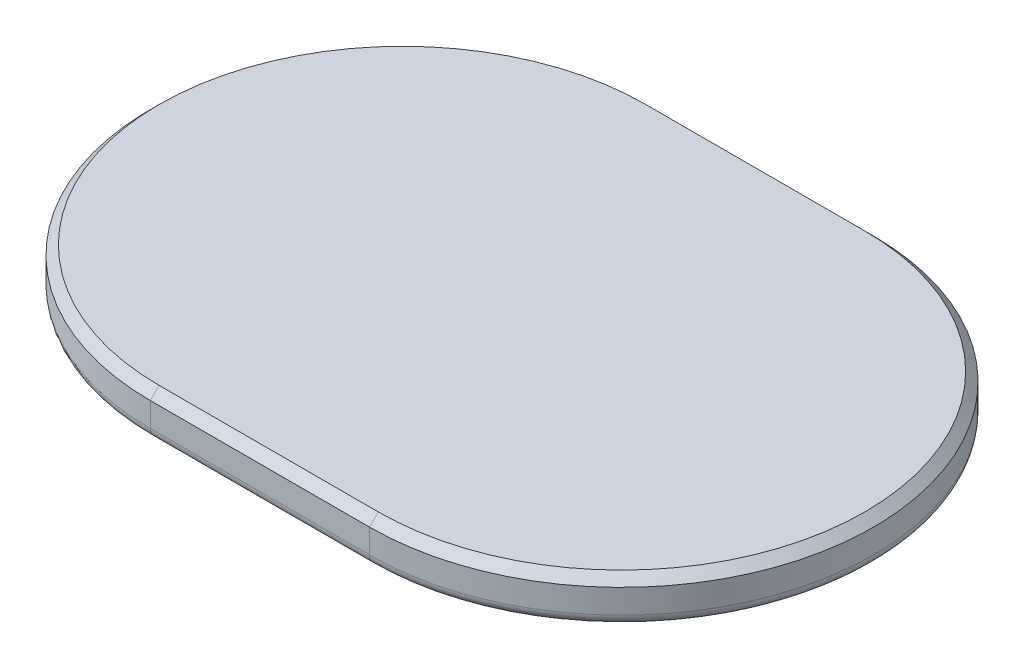
ISO-10303-21;
HEADER;
FILE_DESCRIPTION(('STEP AP214'),'2;1');
FILE_NAME('part.step','',(''),(''),'','','');
FILE_SCHEMA(('AUTOMOTIVE_DESIGN { 1 0 10303 214 1 1 1 1 }'));
ENDSEC;
DATA;
#1=APPLICATION_CONTEXT('core data for automotive mechanical design processes');
#2=APPLICATION_PROTOCOL_DEFINITION('international standard','automotive_design',2000,#1);
#3=PRODUCT_CONTEXT('',#1,'mechanical');
#4=PRODUCT('Part','Part','',(#3));
#5=PRODUCT_RELATED_PRODUCT_CATEGORY('part','',(#4));
#6=PRODUCT_DEFINITION_FORMATION('','',#4);
#7=PRODUCT_DEFINITION_CONTEXT('part definition',#1,'design');
#8=PRODUCT_DEFINITION('design','',#6,#7);
#9=PRODUCT_DEFINITION_SHAPE('','',#8);
#10=(LENGTH_UNIT() NAMED_UNIT(*) SI_UNIT(.MILLI.,.METRE.));
#11=(NAMED_UNIT(*) PLANE_ANGLE_UNIT() SI_UNIT($,.RADIAN.));
#12=(NAMED_UNIT(*) SI_UNIT($,.STERADIAN.) SOLID_ANGLE_UNIT());
#13=UNCERTAINTY_MEASURE_WITH_UNIT(LENGTH_MEASURE(1.E-05),#10,'distance_accuracy_value','');
#14=(GEOMETRIC_REPRESENTATION_CONTEXT(3) GLOBAL_UNCERTAINTY_ASSIGNED_CONTEXT((#13)) GLOBAL_UNIT_ASSIGNED_CONTEXT((#10,
#11,#12)) REPRESENTATION_CONTEXT('',''));
#15=CARTESIAN_POINT('',(0.,0.,0.));
#16=DIRECTION('',(0.,0.,1.));
#17=DIRECTION('',(1.,0.,0.));
#18=AXIS2_PLACEMENT_3D('',#15,#16,#17);
#19=CARTESIAN_POINT('',(-10.,4.,0.));
#20=DIRECTION('',(0.,-1.,0.));
#21=DIRECTION('',(0.,0.,-1.));
#22=AXIS2_PLACEMENT_3D('',#19,#20,#21);
#23=CYLINDRICAL_SURFACE('',#22,23.);
#24=DIRECTION('',(0.,-1.,0.));
#25=VECTOR('',#24,1.);
#26=CARTESIAN_POINT('',(-10.,4.,-23.));
#27=LINE('',#26,#25);
#28=CARTESIAN_POINT('',(-10.,3.19999999999999,-23.));
#29=VERTEX_POINT('',#28);
#30=CARTESIAN_POINT('',(-10.,1.,-23.));
#31=VERTEX_POINT('',#30);
#32=EDGE_CURVE('E155',#29,#31,#27,.T.);
#33=ORIENTED_EDGE('',*,*,#32,.T.);
#34=CARTESIAN_POINT('',(-10.,1.,0.));
#35=DIRECTION('',(0.,1.,0.));
#36=DIRECTION('',(0.,0.,1.));
#37=AXIS2_PLACEMENT_3D('',#34,#35,#36);
#38=CIRCLE('',#37,23.);
#39=CARTESIAN_POINT('',(-10.,1.,23.));
#40=VERTEX_POINT('',#39);
#41=EDGE_CURVE('E11',#31,#40,#38,.T.);
#42=ORIENTED_EDGE('',*,*,#41,.T.);
#43=DIRECTION('',(0.,-1.,0.));
#44=VECTOR('',#43,1.);
#45=CARTESIAN_POINT('',(-10.,4.,23.));
#46=LINE('',#45,#44);
#47=CARTESIAN_POINT('',(-10.,3.19999999999999,23.));
#48=VERTEX_POINT('',#47);
#49=EDGE_CURVE('E129',#48,#40,#46,.T.);
#50=ORIENTED_EDGE('',*,*,#49,.F.);
#51=CARTESIAN_POINT('',(-10.,3.19999999999999,0.));
#52=DIRECTION('',(0.,1.,0.));
#53=DIRECTION('',(0.,0.,1.));
#54=AXIS2_PLACEMENT_3D('',#51,#52,#53);
#55=CIRCLE('',#54,23.);
#56=EDGE_CURVE('E145',#48,#29,#55,.F.);
#57=ORIENTED_EDGE('',*,*,#56,.T.);
#58=EDGE_LOOP('',(#33,#42,#50,#57));
#59=FACE_BOUND('',#58,.T.);
#60=ADVANCED_FACE('F41',(#59),#23,.T.);
#61=CARTESIAN_POINT('',(-10.,4.,23.));
#62=DIRECTION('',(0.,0.,-1.));
#63=DIRECTION('',(-1.,0.,0.));
#64=AXIS2_PLACEMENT_3D('',#61,#62,#63);
#65=PLANE('',#64);
#66=ORIENTED_EDGE('',*,*,#49,.T.);
#67=DIRECTION('',(1.,0.,0.));
#68=VECTOR('',#67,1.);
#69=CARTESIAN_POINT('',(-10.,1.,23.));
#70=LINE('',#69,#68);
#71=CARTESIAN_POINT('',(10.,1.,23.));
#72=VERTEX_POINT('',#71);
#73=EDGE_CURVE('E144',#40,#72,#70,.T.);
#74=ORIENTED_EDGE('',*,*,#73,.T.);
#75=DIRECTION('',(0.,-1.,0.));
#76=VECTOR('',#75,1.);
#77=CARTESIAN_POINT('',(10.,4.,23.));
#78=LINE('',#77,#76);
#79=CARTESIAN_POINT('',(10.,3.19999999999999,23.));
#80=VERTEX_POINT('',#79);
#81=EDGE_CURVE('E194',#80,#72,#78,.T.);
#82=ORIENTED_EDGE('',*,*,#81,.F.);
#83=DIRECTION('',(-1.,0.,0.));
#84=VECTOR('',#83,1.);
#85=CARTESIAN_POINT('',(-10.,3.19999999999999,23.));
#86=LINE('',#85,#84);
#87=EDGE_CURVE('E142',#80,#48,#86,.T.);
#88=ORIENTED_EDGE('',*,*,#87,.T.);
#89=EDGE_LOOP('',(#66,#74,#82,#88));
#90=FACE_BOUND('',#89,.T.);
#91=ADVANCED_FACE('F193',(#90),#65,.F.);
#92=CARTESIAN_POINT('',(10.,4.,0.));
#93=DIRECTION('',(0.,-1.,0.));
#94=DIRECTION('',(0.,0.,-1.));
#95=AXIS2_PLACEMENT_3D('',#92,#93,#94);
#96=CYLINDRICAL_SURFACE('',#95,23.);
#97=ORIENTED_EDGE('',*,*,#81,.T.);
#98=CARTESIAN_POINT('',(10.,1.,0.));
#99=DIRECTION('',(0.,1.,0.));
#100=DIRECTION('',(0.,0.,1.));
#101=AXIS2_PLACEMENT_3D('',#98,#99,#100);
#102=CIRCLE('',#101,23.);
#103=CARTESIAN_POINT('',(9.99999999999999,1.,-23.));
#104=VERTEX_POINT('',#103);
#105=EDGE_CURVE('E61',#72,#104,#102,.T.);
#106=ORIENTED_EDGE('',*,*,#105,.T.);
#107=DIRECTION('',(0.,-1.,0.));
#108=VECTOR('',#107,1.);
#109=CARTESIAN_POINT('',(9.99999999999999,4.,-23.));
#110=LINE('',#109,#108);
#111=CARTESIAN_POINT('',(9.99999999999999,3.19999999999999,-23.));
#112=VERTEX_POINT('',#111);
#113=EDGE_CURVE('E199',#112,#104,#110,.T.);
#114=ORIENTED_EDGE('',*,*,#113,.F.);
#115=CARTESIAN_POINT('',(10.,3.19999999999999,0.));
#116=DIRECTION('',(0.,1.,0.));
#117=DIRECTION('',(0.,0.,1.));
#118=AXIS2_PLACEMENT_3D('',#115,#116,#117);
#119=CIRCLE('',#118,23.);
#120=EDGE_CURVE('E136',#112,#80,#119,.F.);
#121=ORIENTED_EDGE('',*,*,#120,.T.);
#122=EDGE_LOOP('',(#97,#106,#114,#121));
#123=FACE_BOUND('',#122,.T.);
#124=ADVANCED_FACE('F196',(#123),#96,.T.);
#125=CARTESIAN_POINT('',(-10.,4.,-23.));
#126=DIRECTION('',(0.,0.,1.));
#127=DIRECTION('',(1.,0.,0.));
#128=AXIS2_PLACEMENT_3D('',#125,#126,#127);
#129=PLANE('',#128);
#130=ORIENTED_EDGE('',*,*,#113,.T.);
#131=DIRECTION('',(-1.,0.,0.));
#132=VECTOR('',#131,1.);
#133=CARTESIAN_POINT('',(-10.,1.,-23.));
#134=LINE('',#133,#132);
#135=EDGE_CURVE('E49',#104,#31,#134,.T.);
#136=ORIENTED_EDGE('',*,*,#135,.T.);
#137=ORIENTED_EDGE('',*,*,#32,.F.);
#138=DIRECTION('',(1.,0.,0.));
#139=VECTOR('',#138,1.);
#140=CARTESIAN_POINT('',(9.99999999999999,3.19999999999999,-23.));
#141=LINE('',#140,#139);
#142=EDGE_CURVE('E118',#29,#112,#141,.T.);
#143=ORIENTED_EDGE('',*,*,#142,.T.);
#144=EDGE_LOOP('',(#130,#136,#137,#143));
#145=FACE_BOUND('',#144,.T.);
#146=ADVANCED_FACE('F209',(#145),#129,.F.);
#147=CARTESIAN_POINT('',(-10.,4.,0.));
#148=DIRECTION('',(0.,1.,0.));
#149=DIRECTION('',(0.,0.,1.));
#150=AXIS2_PLACEMENT_3D('',#147,#148,#149);
#151=PLANE('',#150);
#152=CARTESIAN_POINT('',(10.,4.,0.));
#153=DIRECTION('',(0.,1.,0.));
#154=DIRECTION('',(0.,0.,1.));
#155=AXIS2_PLACEMENT_3D('',#152,#153,#154);
#156=CIRCLE('',#155,22.2);
#157=CARTESIAN_POINT('',(10.,4.,22.2));
#158=VERTEX_POINT('',#157);
#159=CARTESIAN_POINT('',(9.99999999999999,4.,-22.2));
#160=VERTEX_POINT('',#159);
#161=EDGE_CURVE('E132',#158,#160,#156,.T.);
#162=ORIENTED_EDGE('',*,*,#161,.T.);
#163=DIRECTION('',(-1.,0.,0.));
#164=VECTOR('',#163,1.);
#165=CARTESIAN_POINT('',(-10.,4.,-22.2));
#166=LINE('',#165,#164);
#167=CARTESIAN_POINT('',(-10.,4.,-22.2));
#168=VERTEX_POINT('',#167);
#169=EDGE_CURVE('E111',#160,#168,#166,.T.);
#170=ORIENTED_EDGE('',*,*,#169,.T.);
#171=CARTESIAN_POINT('',(-10.,4.,0.));
#172=DIRECTION('',(0.,1.,0.));
#173=DIRECTION('',(0.,0.,1.));
#174=AXIS2_PLACEMENT_3D('',#171,#172,#173);
#175=CIRCLE('',#174,22.2);
#176=CARTESIAN_POINT('',(-10.,4.,22.2));
#177=VERTEX_POINT('',#176);
#178=EDGE_CURVE('E125',#168,#177,#175,.T.);
#179=ORIENTED_EDGE('',*,*,#178,.T.);
#180=DIRECTION('',(1.,0.,0.));
#181=VECTOR('',#180,1.);
#182=CARTESIAN_POINT('',(10.,4.,22.2));
#183=LINE('',#182,#181);
#184=EDGE_CURVE('E126',#177,#158,#183,.T.);
#185=ORIENTED_EDGE('',*,*,#184,.T.);
#186=EDGE_LOOP('',(#162,#170,#179,#185));
#187=FACE_BOUND('',#186,.T.);
#188=ADVANCED_FACE('F133',(#187),#151,.T.);
#189=CARTESIAN_POINT('',(-10.,0.,0.));
#190=DIRECTION('',(0.,1.,0.));
#191=DIRECTION('',(0.,0.,1.));
#192=AXIS2_PLACEMENT_3D('',#189,#190,#191);
#193=PLANE('',#192);
#194=CARTESIAN_POINT('',(10.,0.,0.));
#195=DIRECTION('',(0.,1.,0.));
#196=DIRECTION('',(0.,0.,1.));
#197=AXIS2_PLACEMENT_3D('',#194,#195,#196);
#198=CIRCLE('',#197,22.);
#199=CARTESIAN_POINT('',(9.99999999999999,0.,-22.));
#200=VERTEX_POINT('',#199);
#201=CARTESIAN_POINT('',(10.,0.,22.));
#202=VERTEX_POINT('',#201);
#203=EDGE_CURVE('E157',#200,#202,#198,.F.);
#204=ORIENTED_EDGE('',*,*,#203,.T.);
#205=DIRECTION('',(1.,0.,0.));
#206=VECTOR('',#205,1.);
#207=CARTESIAN_POINT('',(-10.,0.,22.));
#208=LINE('',#207,#206);
#209=CARTESIAN_POINT('',(-10.,0.,22.));
#210=VERTEX_POINT('',#209);
#211=EDGE_CURVE('E161',#202,#210,#208,.F.);
#212=ORIENTED_EDGE('',*,*,#211,.T.);
#213=CARTESIAN_POINT('',(-10.,0.,0.));
#214=DIRECTION('',(0.,1.,0.));
#215=DIRECTION('',(0.,0.,1.));
#216=AXIS2_PLACEMENT_3D('',#213,#214,#215);
#217=CIRCLE('',#216,22.);
#218=CARTESIAN_POINT('',(-10.,0.,-22.));
#219=VERTEX_POINT('',#218);
#220=EDGE_CURVE('E154',#210,#219,#217,.F.);
#221=ORIENTED_EDGE('',*,*,#220,.T.);
#222=DIRECTION('',(-1.,0.,0.));
#223=VECTOR('',#222,1.);
#224=CARTESIAN_POINT('',(-10.,0.,-22.));
#225=LINE('',#224,#223);
#226=EDGE_CURVE('E160',#219,#200,#225,.F.);
#227=ORIENTED_EDGE('',*,*,#226,.T.);
#228=EDGE_LOOP('',(#204,#212,#221,#227));
#229=FACE_BOUND('',#228,.T.);
#230=ADVANCED_FACE('F184',(#229),#193,.F.);
#231=CARTESIAN_POINT('',(-10.,4.,22.2));
#232=DIRECTION('',(0.,0.707106781186551,0.707106781186544));
#233=DIRECTION('',(-1.,0.,0.));
#234=AXIS2_PLACEMENT_3D('',#231,#232,#233);
#235=PLANE('',#234);
#236=DIRECTION('',(0.,0.707106781186544,-0.707106781186551));
#237=VECTOR('',#236,1.);
#238=CARTESIAN_POINT('',(-10.,3.19999999999999,23.));
#239=LINE('',#238,#237);
#240=EDGE_CURVE('E124',#48,#177,#239,.T.);
#241=ORIENTED_EDGE('',*,*,#240,.F.);
#242=ORIENTED_EDGE('',*,*,#87,.F.);
#243=DIRECTION('',(0.,-0.707106781186544,0.707106781186551));
#244=VECTOR('',#243,1.);
#245=CARTESIAN_POINT('',(10.,4.,22.2));
#246=LINE('',#245,#244);
#247=EDGE_CURVE('E149',#158,#80,#246,.T.);
#248=ORIENTED_EDGE('',*,*,#247,.F.);
#249=ORIENTED_EDGE('',*,*,#184,.F.);
#250=EDGE_LOOP('',(#241,#242,#248,#249));
#251=FACE_BOUND('',#250,.T.);
#252=ADVANCED_FACE('F210',(#251),#235,.T.);
#253=CARTESIAN_POINT('',(10.,4.,0.));
#254=DIRECTION('',(0.,-1.,0.));
#255=DIRECTION('',(0.,0.,-1.));
#256=AXIS2_PLACEMENT_3D('',#253,#254,#255);
#257=CONICAL_SURFACE('',#256,22.2,0.785398163397453);
#258=ORIENTED_EDGE('',*,*,#247,.T.);
#259=ORIENTED_EDGE('',*,*,#120,.F.);
#260=DIRECTION('',(0.,-0.707106781186544,-0.707106781186551));
#261=VECTOR('',#260,1.);
#262=CARTESIAN_POINT('',(9.99999999999999,4.,-22.2));
#263=LINE('',#262,#261);
#264=EDGE_CURVE('E120',#160,#112,#263,.T.);
#265=ORIENTED_EDGE('',*,*,#264,.F.);
#266=ORIENTED_EDGE('',*,*,#161,.F.);
#267=EDGE_LOOP('',(#258,#259,#265,#266));
#268=FACE_BOUND('',#267,.T.);
#269=ADVANCED_FACE('F207',(#268),#257,.T.);
#270=CARTESIAN_POINT('',(-10.,4.,0.));
#271=DIRECTION('',(0.,-1.,0.));
#272=DIRECTION('',(0.,0.,-1.));
#273=AXIS2_PLACEMENT_3D('',#270,#271,#272);
#274=CONICAL_SURFACE('',#273,22.2,0.785398163397453);
#275=ORIENTED_EDGE('',*,*,#240,.T.);
#276=ORIENTED_EDGE('',*,*,#178,.F.);
#277=DIRECTION('',(0.,0.707106781186544,0.707106781186551));
#278=VECTOR('',#277,1.);
#279=CARTESIAN_POINT('',(-10.,3.19999999999999,-23.));
#280=LINE('',#279,#278);
#281=EDGE_CURVE('E109',#29,#168,#280,.T.);
#282=ORIENTED_EDGE('',*,*,#281,.F.);
#283=ORIENTED_EDGE('',*,*,#56,.F.);
#284=EDGE_LOOP('',(#275,#276,#282,#283));
#285=FACE_BOUND('',#284,.T.);
#286=ADVANCED_FACE('F122',(#285),#274,.T.);
#287=CARTESIAN_POINT('',(-10.,4.,-22.2));
#288=DIRECTION('',(0.,0.707106781186551,-0.707106781186544));
#289=DIRECTION('',(1.,0.,0.));
#290=AXIS2_PLACEMENT_3D('',#287,#288,#289);
#291=PLANE('',#290);
#292=ORIENTED_EDGE('',*,*,#264,.T.);
#293=ORIENTED_EDGE('',*,*,#142,.F.);
#294=ORIENTED_EDGE('',*,*,#281,.T.);
#295=ORIENTED_EDGE('',*,*,#169,.F.);
#296=EDGE_LOOP('',(#292,#293,#294,#295));
#297=FACE_BOUND('',#296,.T.);
#298=ADVANCED_FACE('F115',(#297),#291,.T.);
#299=CARTESIAN_POINT('',(-10.,1.,-22.));
#300=DIRECTION('',(-1.,0.,0.));
#301=DIRECTION('',(0.,0.,1.));
#302=AXIS2_PLACEMENT_3D('',#299,#300,#301);
#303=CYLINDRICAL_SURFACE('',#302,1.);
#304=CARTESIAN_POINT('',(9.99999999999999,1.,-22.));
#305=DIRECTION('',(1.,0.,0.));
#306=DIRECTION('',(0.,0.,-1.));
#307=AXIS2_PLACEMENT_3D('',#304,#305,#306);
#308=CIRCLE('',#307,1.);
#309=EDGE_CURVE('E166',#200,#104,#308,.T.);
#310=ORIENTED_EDGE('',*,*,#309,.F.);
#311=ORIENTED_EDGE('',*,*,#226,.F.);
#312=CARTESIAN_POINT('',(-10.,1.,-22.));
#313=DIRECTION('',(-1.,0.,0.));
#314=DIRECTION('',(0.,0.,1.));
#315=AXIS2_PLACEMENT_3D('',#312,#313,#314);
#316=CIRCLE('',#315,1.);
#317=EDGE_CURVE('E44',#31,#219,#316,.T.);
#318=ORIENTED_EDGE('',*,*,#317,.F.);
#319=ORIENTED_EDGE('',*,*,#135,.F.);
#320=EDGE_LOOP('',(#310,#311,#318,#319));
#321=FACE_BOUND('',#320,.T.);
#322=ADVANCED_FACE('F43',(#321),#303,.T.);
#323=CARTESIAN_POINT('',(-10.,1.,0.));
#324=DIRECTION('',(0.,1.,0.));
#325=DIRECTION('',(0.,0.,1.));
#326=AXIS2_PLACEMENT_3D('',#323,#324,#325);
#327=TOROIDAL_SURFACE('',#326,22.,1.);
#328=ORIENTED_EDGE('',*,*,#317,.T.);
#329=ORIENTED_EDGE('',*,*,#220,.F.);
#330=CARTESIAN_POINT('',(-10.,1.,22.));
#331=DIRECTION('',(1.,0.,0.));
#332=DIRECTION('',(0.,0.,-1.));
#333=AXIS2_PLACEMENT_3D('',#330,#331,#332);
#334=CIRCLE('',#333,1.);
#335=EDGE_CURVE('E169',#40,#210,#334,.T.);
#336=ORIENTED_EDGE('',*,*,#335,.F.);
#337=ORIENTED_EDGE('',*,*,#41,.F.);
#338=EDGE_LOOP('',(#328,#329,#336,#337));
#339=FACE_BOUND('',#338,.T.);
#340=ADVANCED_FACE('F178',(#339),#327,.T.);
#341=CARTESIAN_POINT('',(10.,1.,0.));
#342=DIRECTION('',(0.,1.,0.));
#343=DIRECTION('',(0.,0.,1.));
#344=AXIS2_PLACEMENT_3D('',#341,#342,#343);
#345=TOROIDAL_SURFACE('',#344,22.,1.);
#346=ORIENTED_EDGE('',*,*,#309,.T.);
#347=ORIENTED_EDGE('',*,*,#105,.F.);
#348=CARTESIAN_POINT('',(10.,1.,22.));
#349=DIRECTION('',(-1.,0.,0.));
#350=DIRECTION('',(0.,0.,1.));
#351=AXIS2_PLACEMENT_3D('',#348,#349,#350);
#352=CIRCLE('',#351,1.);
#353=EDGE_CURVE('E167',#202,#72,#352,.T.);
#354=ORIENTED_EDGE('',*,*,#353,.F.);
#355=ORIENTED_EDGE('',*,*,#203,.F.);
#356=EDGE_LOOP('',(#346,#347,#354,#355));
#357=FACE_BOUND('',#356,.T.);
#358=ADVANCED_FACE('F186',(#357),#345,.T.);
#359=CARTESIAN_POINT('',(-10.,1.,22.));
#360=DIRECTION('',(1.,0.,0.));
#361=DIRECTION('',(0.,0.,-1.));
#362=AXIS2_PLACEMENT_3D('',#359,#360,#361);
#363=CYLINDRICAL_SURFACE('',#362,1.);
#364=ORIENTED_EDGE('',*,*,#335,.T.);
#365=ORIENTED_EDGE('',*,*,#211,.F.);
#366=ORIENTED_EDGE('',*,*,#353,.T.);
#367=ORIENTED_EDGE('',*,*,#73,.F.);
#368=EDGE_LOOP('',(#364,#365,#366,#367));
#369=FACE_BOUND('',#368,.T.);
#370=ADVANCED_FACE('F187',(#369),#363,.T.);
#371=CLOSED_SHELL('',(#60,#91,#124,#146,#188,#230,#252,#269,#286,#298,#322,#340,#358,#370));
#372=MANIFOLD_SOLID_BREP('B2',#371);
#373=ADVANCED_BREP_SHAPE_REPRESENTATION('',(#18,#372),#14);
#374=SHAPE_DEFINITION_REPRESENTATION(#9,#373);
ENDSEC;
END-ISO-10303-21;
